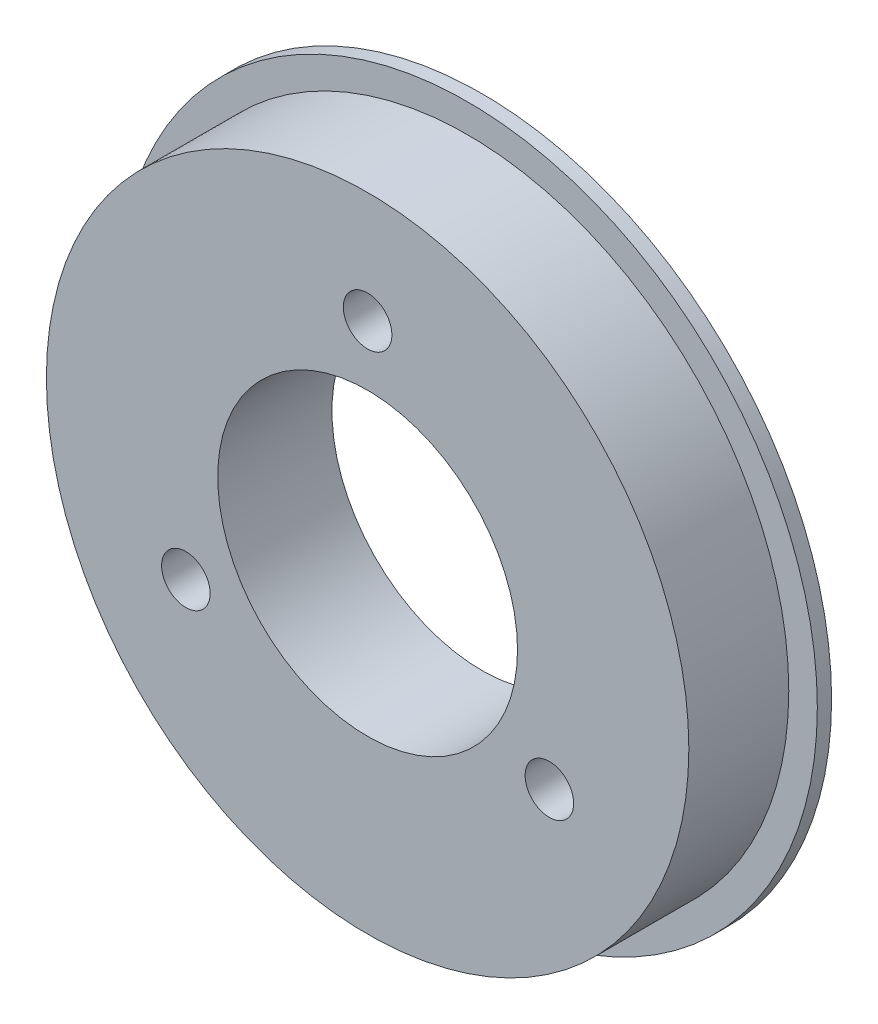
ISO-10303-21;
HEADER;
FILE_DESCRIPTION(('STEP AP214'),'2;1');
FILE_NAME('part.step','',(''),(''),'','','');
FILE_SCHEMA(('AUTOMOTIVE_DESIGN { 1 0 10303 214 1 1 1 1 }'));
ENDSEC;
DATA;
#1=APPLICATION_CONTEXT('core data for automotive mechanical design processes');
#2=APPLICATION_PROTOCOL_DEFINITION('international standard','automotive_design',2000,#1);
#3=PRODUCT_CONTEXT('',#1,'mechanical');
#4=PRODUCT('Part','Part','',(#3));
#5=PRODUCT_RELATED_PRODUCT_CATEGORY('part','',(#4));
#6=PRODUCT_DEFINITION_FORMATION('','',#4);
#7=PRODUCT_DEFINITION_CONTEXT('part definition',#1,'design');
#8=PRODUCT_DEFINITION('design','',#6,#7);
#9=PRODUCT_DEFINITION_SHAPE('','',#8);
#10=(LENGTH_UNIT() NAMED_UNIT(*) SI_UNIT(.MILLI.,.METRE.));
#11=(NAMED_UNIT(*) PLANE_ANGLE_UNIT() SI_UNIT($,.RADIAN.));
#12=(NAMED_UNIT(*) SI_UNIT($,.STERADIAN.) SOLID_ANGLE_UNIT());
#13=UNCERTAINTY_MEASURE_WITH_UNIT(LENGTH_MEASURE(1.E-05),#10,'distance_accuracy_value','');
#14=(GEOMETRIC_REPRESENTATION_CONTEXT(3) GLOBAL_UNCERTAINTY_ASSIGNED_CONTEXT((#13)) GLOBAL_UNIT_ASSIGNED_CONTEXT((#10,
#11,#12)) REPRESENTATION_CONTEXT('',''));
#15=CARTESIAN_POINT('',(0.,0.,0.));
#16=DIRECTION('',(0.,0.,1.));
#17=DIRECTION('',(1.,0.,0.));
#18=AXIS2_PLACEMENT_3D('',#15,#16,#17);
#19=CARTESIAN_POINT('',(0.,0.,7.));
#20=DIRECTION('',(0.,0.,-1.));
#21=DIRECTION('',(-1.,0.,0.));
#22=AXIS2_PLACEMENT_3D('',#19,#20,#21);
#23=CYLINDRICAL_SURFACE('',#22,10.5);
#24=CARTESIAN_POINT('',(0.,0.,7.));
#25=DIRECTION('',(0.,0.,1.));
#26=DIRECTION('',(1.,0.,0.));
#27=AXIS2_PLACEMENT_3D('',#24,#25,#26);
#28=CIRCLE('',#27,10.5);
#29=CARTESIAN_POINT('',(10.5,0.,7.));
#30=VERTEX_POINT('',#29);
#31=EDGE_CURVE('E48',#30,#30,#28,.T.);
#32=ORIENTED_EDGE('',*,*,#31,.T.);
#33=EDGE_LOOP('',(#32));
#34=FACE_BOUND('',#33,.T.);
#35=CARTESIAN_POINT('',(0.,0.,-1.));
#36=DIRECTION('',(0.,0.,1.));
#37=DIRECTION('',(1.,0.,0.));
#38=AXIS2_PLACEMENT_3D('',#35,#36,#37);
#39=CIRCLE('',#38,10.5);
#40=CARTESIAN_POINT('',(10.5,0.,-1.));
#41=VERTEX_POINT('',#40);
#42=EDGE_CURVE('E72',#41,#41,#39,.T.);
#43=ORIENTED_EDGE('',*,*,#42,.F.);
#44=EDGE_LOOP('',(#43));
#45=FACE_BOUND('',#44,.T.);
#46=ADVANCED_FACE('F39',(#34,#45),#23,.F.);
#47=CARTESIAN_POINT('',(0.,14.7,7.));
#48=DIRECTION('',(0.,0.,-1.));
#49=DIRECTION('',(-1.,0.,0.));
#50=AXIS2_PLACEMENT_3D('',#47,#48,#49);
#51=CYLINDRICAL_SURFACE('',#50,1.7);
#52=CARTESIAN_POINT('',(0.,14.7,7.));
#53=DIRECTION('',(0.,0.,1.));
#54=DIRECTION('',(1.,0.,0.));
#55=AXIS2_PLACEMENT_3D('',#52,#53,#54);
#56=CIRCLE('',#55,1.7);
#57=CARTESIAN_POINT('',(1.7,14.7,7.));
#58=VERTEX_POINT('',#57);
#59=EDGE_CURVE('E53',#58,#58,#56,.T.);
#60=ORIENTED_EDGE('',*,*,#59,.T.);
#61=EDGE_LOOP('',(#60));
#62=FACE_BOUND('',#61,.T.);
#63=CARTESIAN_POINT('',(0.,14.7,-1.));
#64=DIRECTION('',(0.,0.,1.));
#65=DIRECTION('',(1.,0.,0.));
#66=AXIS2_PLACEMENT_3D('',#63,#64,#65);
#67=CIRCLE('',#66,1.7);
#68=CARTESIAN_POINT('',(1.7,14.7,-1.));
#69=VERTEX_POINT('',#68);
#70=EDGE_CURVE('E76',#69,#69,#67,.T.);
#71=ORIENTED_EDGE('',*,*,#70,.F.);
#72=EDGE_LOOP('',(#71));
#73=FACE_BOUND('',#72,.T.);
#74=ADVANCED_FACE('F109',(#62,#73),#51,.F.);
#75=CARTESIAN_POINT('',(12.7305734356322,-7.34999999999946,7.));
#76=DIRECTION('',(0.,0.,-1.));
#77=DIRECTION('',(-1.,0.,0.));
#78=AXIS2_PLACEMENT_3D('',#75,#76,#77);
#79=CYLINDRICAL_SURFACE('',#78,1.7);
#80=CARTESIAN_POINT('',(12.7305734356322,-7.34999999999946,7.));
#81=DIRECTION('',(0.,0.,1.));
#82=DIRECTION('',(1.,0.,0.));
#83=AXIS2_PLACEMENT_3D('',#80,#81,#82);
#84=CIRCLE('',#83,1.7);
#85=CARTESIAN_POINT('',(14.4305734356322,-7.34999999999946,7.));
#86=VERTEX_POINT('',#85);
#87=EDGE_CURVE('E59',#86,#86,#84,.T.);
#88=ORIENTED_EDGE('',*,*,#87,.T.);
#89=EDGE_LOOP('',(#88));
#90=FACE_BOUND('',#89,.T.);
#91=CARTESIAN_POINT('',(12.7305734356322,-7.34999999999946,-1.));
#92=DIRECTION('',(0.,0.,1.));
#93=DIRECTION('',(1.,0.,0.));
#94=AXIS2_PLACEMENT_3D('',#91,#92,#93);
#95=CIRCLE('',#94,1.7);
#96=CARTESIAN_POINT('',(14.4305734356322,-7.34999999999946,-1.));
#97=VERTEX_POINT('',#96);
#98=EDGE_CURVE('E80',#97,#97,#95,.T.);
#99=ORIENTED_EDGE('',*,*,#98,.F.);
#100=EDGE_LOOP('',(#99));
#101=FACE_BOUND('',#100,.T.);
#102=ADVANCED_FACE('F115',(#90,#101),#79,.F.);
#103=CARTESIAN_POINT('',(-12.7305734356303,-7.35000000000055,7.));
#104=DIRECTION('',(0.,0.,-1.));
#105=DIRECTION('',(-1.,0.,0.));
#106=AXIS2_PLACEMENT_3D('',#103,#104,#105);
#107=CYLINDRICAL_SURFACE('',#106,1.7);
#108=CARTESIAN_POINT('',(-12.7305734356303,-7.35000000000055,7.));
#109=DIRECTION('',(0.,0.,1.));
#110=DIRECTION('',(1.,0.,0.));
#111=AXIS2_PLACEMENT_3D('',#108,#109,#110);
#112=CIRCLE('',#111,1.7);
#113=CARTESIAN_POINT('',(-11.0305734356303,-7.35000000000055,7.));
#114=VERTEX_POINT('',#113);
#115=EDGE_CURVE('E63',#114,#114,#112,.T.);
#116=ORIENTED_EDGE('',*,*,#115,.T.);
#117=EDGE_LOOP('',(#116));
#118=FACE_BOUND('',#117,.T.);
#119=CARTESIAN_POINT('',(-12.7305734356303,-7.35000000000055,-1.));
#120=DIRECTION('',(0.,0.,1.));
#121=DIRECTION('',(1.,0.,0.));
#122=AXIS2_PLACEMENT_3D('',#119,#120,#121);
#123=CIRCLE('',#122,1.7);
#124=CARTESIAN_POINT('',(-11.0305734356303,-7.35000000000055,-1.));
#125=VERTEX_POINT('',#124);
#126=EDGE_CURVE('E84',#125,#125,#123,.T.);
#127=ORIENTED_EDGE('',*,*,#126,.F.);
#128=EDGE_LOOP('',(#127));
#129=FACE_BOUND('',#128,.T.);
#130=ADVANCED_FACE('F41',(#118,#129),#107,.F.);
#131=CARTESIAN_POINT('',(0.,0.,7.));
#132=DIRECTION('',(0.,0.,-1.));
#133=DIRECTION('',(-1.,0.,0.));
#134=AXIS2_PLACEMENT_3D('',#131,#132,#133);
#135=CYLINDRICAL_SURFACE('',#134,22.5);
#136=CARTESIAN_POINT('',(0.,0.,7.));
#137=DIRECTION('',(0.,0.,1.));
#138=DIRECTION('',(1.,0.,0.));
#139=AXIS2_PLACEMENT_3D('',#136,#137,#138);
#140=CIRCLE('',#139,22.5);
#141=CARTESIAN_POINT('',(22.5,0.,7.));
#142=VERTEX_POINT('',#141);
#143=EDGE_CURVE('E10',#142,#142,#140,.T.);
#144=ORIENTED_EDGE('',*,*,#143,.F.);
#145=EDGE_LOOP('',(#144));
#146=FACE_BOUND('',#145,.T.);
#147=CARTESIAN_POINT('',(0.,0.,0.));
#148=DIRECTION('',(0.,0.,1.));
#149=DIRECTION('',(1.,0.,0.));
#150=AXIS2_PLACEMENT_3D('',#147,#148,#149);
#151=CIRCLE('',#150,22.5);
#152=CARTESIAN_POINT('',(22.5,0.,0.));
#153=VERTEX_POINT('',#152);
#154=EDGE_CURVE('E43',#153,#153,#151,.T.);
#155=ORIENTED_EDGE('',*,*,#154,.T.);
#156=EDGE_LOOP('',(#155));
#157=FACE_BOUND('',#156,.T.);
#158=ADVANCED_FACE('F119',(#146,#157),#135,.T.);
#159=CARTESIAN_POINT('',(0.,0.,7.));
#160=DIRECTION('',(0.,0.,1.));
#161=DIRECTION('',(1.,0.,0.));
#162=AXIS2_PLACEMENT_3D('',#159,#160,#161);
#163=PLANE('',#162);
#164=ORIENTED_EDGE('',*,*,#115,.F.);
#165=EDGE_LOOP('',(#164));
#166=FACE_BOUND('',#165,.T.);
#167=ORIENTED_EDGE('',*,*,#87,.F.);
#168=EDGE_LOOP('',(#167));
#169=FACE_BOUND('',#168,.T.);
#170=ORIENTED_EDGE('',*,*,#59,.F.);
#171=EDGE_LOOP('',(#170));
#172=FACE_BOUND('',#171,.T.);
#173=ORIENTED_EDGE('',*,*,#31,.F.);
#174=EDGE_LOOP('',(#173));
#175=FACE_BOUND('',#174,.T.);
#176=ORIENTED_EDGE('',*,*,#143,.T.);
#177=EDGE_LOOP('',(#176));
#178=FACE_BOUND('',#177,.T.);
#179=ADVANCED_FACE('F130',(#166,#169,#172,#175,#178),#163,.T.);
#180=CARTESIAN_POINT('',(0.,0.,-1.));
#181=DIRECTION('',(0.,0.,1.));
#182=DIRECTION('',(1.,0.,0.));
#183=AXIS2_PLACEMENT_3D('',#180,#181,#182);
#184=CYLINDRICAL_SURFACE('',#183,24.5);
#185=CARTESIAN_POINT('',(0.,0.,-1.));
#186=DIRECTION('',(0.,0.,1.));
#187=DIRECTION('',(1.,0.,0.));
#188=AXIS2_PLACEMENT_3D('',#185,#186,#187);
#189=CIRCLE('',#188,24.5);
#190=CARTESIAN_POINT('',(24.5,0.,-1.));
#191=VERTEX_POINT('',#190);
#192=EDGE_CURVE('E71',#191,#191,#189,.T.);
#193=ORIENTED_EDGE('',*,*,#192,.T.);
#194=EDGE_LOOP('',(#193));
#195=FACE_BOUND('',#194,.T.);
#196=CARTESIAN_POINT('',(0.,0.,0.));
#197=DIRECTION('',(0.,0.,1.));
#198=DIRECTION('',(1.,0.,0.));
#199=AXIS2_PLACEMENT_3D('',#196,#197,#198);
#200=CIRCLE('',#199,24.5);
#201=CARTESIAN_POINT('',(24.5,0.,0.));
#202=VERTEX_POINT('',#201);
#203=EDGE_CURVE('E67',#202,#202,#200,.T.);
#204=ORIENTED_EDGE('',*,*,#203,.F.);
#205=EDGE_LOOP('',(#204));
#206=FACE_BOUND('',#205,.T.);
#207=ADVANCED_FACE('F92',(#195,#206),#184,.T.);
#208=CARTESIAN_POINT('',(0.,0.,-1.));
#209=DIRECTION('',(0.,0.,1.));
#210=DIRECTION('',(1.,0.,0.));
#211=AXIS2_PLACEMENT_3D('',#208,#209,#210);
#212=PLANE('',#211);
#213=ORIENTED_EDGE('',*,*,#192,.F.);
#214=EDGE_LOOP('',(#213));
#215=FACE_BOUND('',#214,.T.);
#216=ORIENTED_EDGE('',*,*,#126,.T.);
#217=EDGE_LOOP('',(#216));
#218=FACE_BOUND('',#217,.T.);
#219=ORIENTED_EDGE('',*,*,#98,.T.);
#220=EDGE_LOOP('',(#219));
#221=FACE_BOUND('',#220,.T.);
#222=ORIENTED_EDGE('',*,*,#70,.T.);
#223=EDGE_LOOP('',(#222));
#224=FACE_BOUND('',#223,.T.);
#225=ORIENTED_EDGE('',*,*,#42,.T.);
#226=EDGE_LOOP('',(#225));
#227=FACE_BOUND('',#226,.T.);
#228=ADVANCED_FACE('F95',(#215,#218,#221,#224,#227),#212,.F.);
#229=CARTESIAN_POINT('',(0.,0.,0.));
#230=DIRECTION('',(0.,0.,1.));
#231=DIRECTION('',(1.,0.,0.));
#232=AXIS2_PLACEMENT_3D('',#229,#230,#231);
#233=PLANE('',#232);
#234=ORIENTED_EDGE('',*,*,#154,.F.);
#235=EDGE_LOOP('',(#234));
#236=FACE_BOUND('',#235,.T.);
#237=ORIENTED_EDGE('',*,*,#203,.T.);
#238=EDGE_LOOP('',(#237));
#239=FACE_BOUND('',#238,.T.);
#240=ADVANCED_FACE('F98',(#236,#239),#233,.T.);
#241=CLOSED_SHELL('',(#46,#74,#102,#130,#158,#179,#207,#228,#240));
#242=MANIFOLD_SOLID_BREP('B2',#241);
#243=ADVANCED_BREP_SHAPE_REPRESENTATION('',(#18,#242),#14);
#244=SHAPE_DEFINITION_REPRESENTATION(#9,#243);
ENDSEC;
END-ISO-10303-21;
